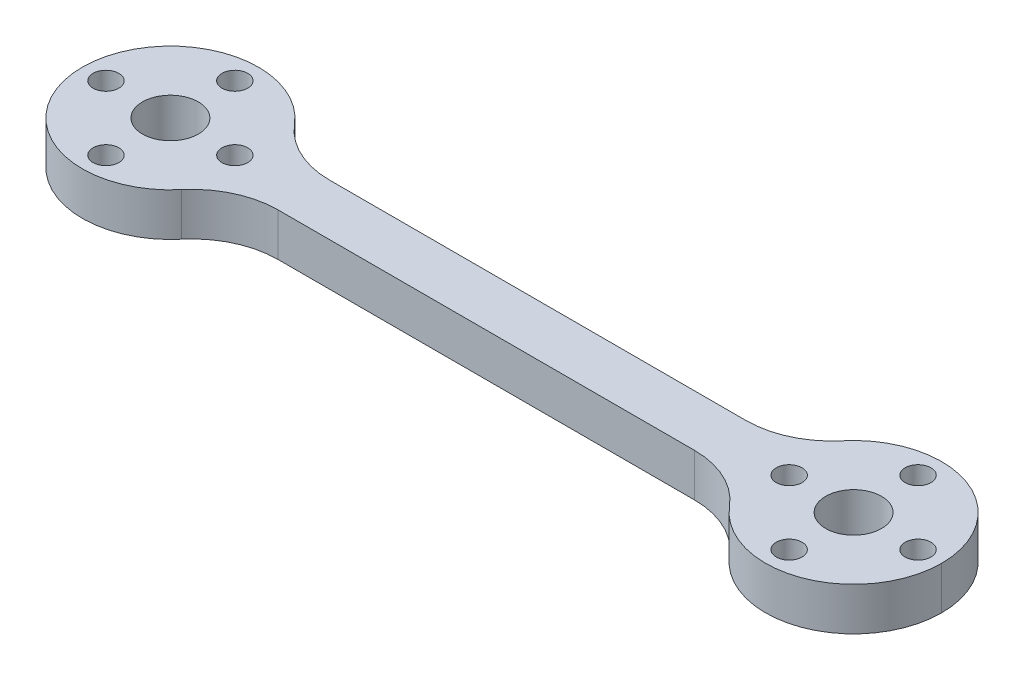
ISO-10303-21;
HEADER;
FILE_DESCRIPTION(('STEP AP214'),'2;1');
FILE_NAME('part.step','',(''),(''),'','','');
FILE_SCHEMA(('AUTOMOTIVE_DESIGN { 1 0 10303 214 1 1 1 1 }'));
ENDSEC;
DATA;
#1=APPLICATION_CONTEXT('core data for automotive mechanical design processes');
#2=APPLICATION_PROTOCOL_DEFINITION('international standard','automotive_design',2000,#1);
#3=PRODUCT_CONTEXT('',#1,'mechanical');
#4=PRODUCT('Part','Part','',(#3));
#5=PRODUCT_RELATED_PRODUCT_CATEGORY('part','',(#4));
#6=PRODUCT_DEFINITION_FORMATION('','',#4);
#7=PRODUCT_DEFINITION_CONTEXT('part definition',#1,'design');
#8=PRODUCT_DEFINITION('design','',#6,#7);
#9=PRODUCT_DEFINITION_SHAPE('','',#8);
#10=(LENGTH_UNIT() NAMED_UNIT(*) SI_UNIT(.MILLI.,.METRE.));
#11=(NAMED_UNIT(*) PLANE_ANGLE_UNIT() SI_UNIT($,.RADIAN.));
#12=(NAMED_UNIT(*) SI_UNIT($,.STERADIAN.) SOLID_ANGLE_UNIT());
#13=UNCERTAINTY_MEASURE_WITH_UNIT(LENGTH_MEASURE(1.E-05),#10,'distance_accuracy_value','');
#14=(GEOMETRIC_REPRESENTATION_CONTEXT(3) GLOBAL_UNCERTAINTY_ASSIGNED_CONTEXT((#13)) GLOBAL_UNIT_ASSIGNED_CONTEXT((#10,
#11,#12)) REPRESENTATION_CONTEXT('',''));
#15=CARTESIAN_POINT('',(0.,0.,0.));
#16=DIRECTION('',(0.,0.,1.));
#17=DIRECTION('',(1.,0.,0.));
#18=AXIS2_PLACEMENT_3D('',#15,#16,#17);
#19=CARTESIAN_POINT('',(0.,5.,0.));
#20=DIRECTION('',(0.,-1.,0.));
#21=DIRECTION('',(0.,0.,-1.));
#22=AXIS2_PLACEMENT_3D('',#19,#20,#21);
#23=PLANE('',#22);
#24=DIRECTION('',(1.,0.,0.));
#25=VECTOR('',#24,1.);
#26=CARTESIAN_POINT('',(20.0511478919563,5.,-13.25));
#27=LINE('',#26,#25);
#28=CARTESIAN_POINT('',(25.7761875552242,5.,-13.25));
#29=VERTEX_POINT('',#28);
#30=CARTESIAN_POINT('',(74.2238124447758,5.,-13.25));
#31=VERTEX_POINT('',#30);
#32=EDGE_CURVE('E140',#29,#31,#27,.T.);
#33=ORIENTED_EDGE('',*,*,#32,.F.);
#34=CARTESIAN_POINT('',(25.7761875552242,5.,-23.25));
#35=DIRECTION('',(0.,-1.,0.));
#36=DIRECTION('',(0.,0.,-1.));
#37=AXIS2_PLACEMENT_3D('',#34,#35,#36);
#38=CIRCLE('',#37,10.);
#39=CARTESIAN_POINT('',(18.1089344415333,5.,-16.8302469135803));
#40=VERTEX_POINT('',#39);
#41=EDGE_CURVE('E43',#29,#40,#38,.T.);
#42=ORIENTED_EDGE('',*,*,#41,.T.);
#43=CARTESIAN_POINT('',(10.25,5.,-10.25));
#44=DIRECTION('',(0.,-1.,0.));
#45=DIRECTION('',(0.,0.,-1.));
#46=AXIS2_PLACEMENT_3D('',#43,#44,#45);
#47=CIRCLE('',#46,10.25);
#48=CARTESIAN_POINT('',(0.,5.,-10.25));
#49=VERTEX_POINT('',#48);
#50=EDGE_CURVE('E248',#40,#49,#47,.F.);
#51=ORIENTED_EDGE('',*,*,#50,.T.);
#52=CARTESIAN_POINT('',(10.25,5.,-10.25));
#53=DIRECTION('',(0.,-1.,0.));
#54=DIRECTION('',(0.,0.,-1.));
#55=AXIS2_PLACEMENT_3D('',#52,#53,#54);
#56=CIRCLE('',#55,10.25);
#57=CARTESIAN_POINT('',(18.1089344415333,5.,-3.66975308641975));
#58=VERTEX_POINT('',#57);
#59=EDGE_CURVE('E132',#49,#58,#56,.F.);
#60=ORIENTED_EDGE('',*,*,#59,.T.);
#61=CARTESIAN_POINT('',(25.7761875552242,5.,2.75));
#62=DIRECTION('',(0.,-1.,0.));
#63=DIRECTION('',(0.,0.,-1.));
#64=AXIS2_PLACEMENT_3D('',#61,#62,#63);
#65=CIRCLE('',#64,10.);
#66=CARTESIAN_POINT('',(25.7761875552242,5.,-7.25));
#67=VERTEX_POINT('',#66);
#68=EDGE_CURVE('E177',#58,#67,#65,.T.);
#69=ORIENTED_EDGE('',*,*,#68,.T.);
#70=DIRECTION('',(-1.,0.,0.));
#71=VECTOR('',#70,1.);
#72=CARTESIAN_POINT('',(20.0511478919563,5.,-7.25));
#73=LINE('',#72,#71);
#74=CARTESIAN_POINT('',(74.2238124447758,5.,-7.25000000000002));
#75=VERTEX_POINT('',#74);
#76=EDGE_CURVE('E182',#75,#67,#73,.T.);
#77=ORIENTED_EDGE('',*,*,#76,.F.);
#78=CARTESIAN_POINT('',(74.2238124447758,5.,2.74999999999998));
#79=DIRECTION('',(0.,-1.,0.));
#80=DIRECTION('',(0.,0.,-1.));
#81=AXIS2_PLACEMENT_3D('',#78,#79,#80);
#82=CIRCLE('',#81,10.);
#83=CARTESIAN_POINT('',(81.8910655584668,5.,-3.66975308641976));
#84=VERTEX_POINT('',#83);
#85=EDGE_CURVE('E173',#75,#84,#82,.T.);
#86=ORIENTED_EDGE('',*,*,#85,.T.);
#87=CARTESIAN_POINT('',(89.75,5.,-10.25));
#88=DIRECTION('',(0.,-1.,0.));
#89=DIRECTION('',(0.,0.,-1.));
#90=AXIS2_PLACEMENT_3D('',#87,#88,#89);
#91=CIRCLE('',#90,10.25);
#92=CARTESIAN_POINT('',(100.,5.,-10.25));
#93=VERTEX_POINT('',#92);
#94=EDGE_CURVE('E122',#84,#93,#91,.F.);
#95=ORIENTED_EDGE('',*,*,#94,.T.);
#96=CARTESIAN_POINT('',(89.75,5.,-10.25));
#97=DIRECTION('',(0.,-1.,0.));
#98=DIRECTION('',(0.,0.,-1.));
#99=AXIS2_PLACEMENT_3D('',#96,#97,#98);
#100=CIRCLE('',#99,10.25);
#101=CARTESIAN_POINT('',(81.8910655584668,5.,-16.8302469135803));
#102=VERTEX_POINT('',#101);
#103=EDGE_CURVE('E247',#93,#102,#100,.F.);
#104=ORIENTED_EDGE('',*,*,#103,.T.);
#105=CARTESIAN_POINT('',(74.2238124447758,5.,-23.25));
#106=DIRECTION('',(0.,-1.,0.));
#107=DIRECTION('',(0.,0.,-1.));
#108=AXIS2_PLACEMENT_3D('',#105,#106,#107);
#109=CIRCLE('',#108,10.);
#110=EDGE_CURVE('E169',#102,#31,#109,.T.);
#111=ORIENTED_EDGE('',*,*,#110,.T.);
#112=EDGE_LOOP('',(#33,#42,#51,#60,#69,#77,#86,#95,#104,#111));
#113=FACE_BOUND('',#112,.T.);
#114=CARTESIAN_POINT('',(10.25,5.,-10.25));
#115=DIRECTION('',(0.,1.,0.));
#116=DIRECTION('',(0.,0.,1.));
#117=AXIS2_PLACEMENT_3D('',#114,#115,#116);
#118=CIRCLE('',#117,3.25);
#119=CARTESIAN_POINT('',(10.25,5.,-7.));
#120=VERTEX_POINT('',#119);
#121=EDGE_CURVE('E242',#120,#120,#118,.T.);
#122=ORIENTED_EDGE('',*,*,#121,.F.);
#123=EDGE_LOOP('',(#122));
#124=FACE_BOUND('',#123,.T.);
#125=CARTESIAN_POINT('',(17.75,5.,-10.25));
#126=DIRECTION('',(0.,1.,0.));
#127=DIRECTION('',(0.,0.,1.));
#128=AXIS2_PLACEMENT_3D('',#125,#126,#127);
#129=CIRCLE('',#128,1.5);
#130=CARTESIAN_POINT('',(17.75,5.,-8.75));
#131=VERTEX_POINT('',#130);
#132=EDGE_CURVE('E299',#131,#131,#129,.T.);
#133=ORIENTED_EDGE('',*,*,#132,.F.);
#134=EDGE_LOOP('',(#133));
#135=FACE_BOUND('',#134,.T.);
#136=CARTESIAN_POINT('',(10.25,5.,-17.75));
#137=DIRECTION('',(0.,1.,0.));
#138=DIRECTION('',(0.,0.,-1.));
#139=AXIS2_PLACEMENT_3D('',#136,#137,#138);
#140=CIRCLE('',#139,1.5);
#141=CARTESIAN_POINT('',(10.25,5.,-19.25));
#142=VERTEX_POINT('',#141);
#143=EDGE_CURVE('E293',#142,#142,#140,.T.);
#144=ORIENTED_EDGE('',*,*,#143,.F.);
#145=EDGE_LOOP('',(#144));
#146=FACE_BOUND('',#145,.T.);
#147=CARTESIAN_POINT('',(10.25,5.,-2.75));
#148=DIRECTION('',(0.,1.,0.));
#149=DIRECTION('',(0.,0.,-1.));
#150=AXIS2_PLACEMENT_3D('',#147,#148,#149);
#151=CIRCLE('',#150,1.5);
#152=CARTESIAN_POINT('',(10.25,5.,-4.25));
#153=VERTEX_POINT('',#152);
#154=EDGE_CURVE('E287',#153,#153,#151,.T.);
#155=ORIENTED_EDGE('',*,*,#154,.F.);
#156=EDGE_LOOP('',(#155));
#157=FACE_BOUND('',#156,.T.);
#158=CARTESIAN_POINT('',(2.75,5.,-10.25));
#159=DIRECTION('',(0.,1.,0.));
#160=DIRECTION('',(0.,0.,1.));
#161=AXIS2_PLACEMENT_3D('',#158,#159,#160);
#162=CIRCLE('',#161,1.5);
#163=CARTESIAN_POINT('',(2.75,5.,-8.75));
#164=VERTEX_POINT('',#163);
#165=EDGE_CURVE('E281',#164,#164,#162,.T.);
#166=ORIENTED_EDGE('',*,*,#165,.F.);
#167=EDGE_LOOP('',(#166));
#168=FACE_BOUND('',#167,.T.);
#169=CARTESIAN_POINT('',(82.25,5.,-10.25));
#170=DIRECTION('',(0.,1.,0.));
#171=DIRECTION('',(0.,0.,-1.));
#172=AXIS2_PLACEMENT_3D('',#169,#170,#171);
#173=CIRCLE('',#172,1.5);
#174=CARTESIAN_POINT('',(82.25,5.,-11.75));
#175=VERTEX_POINT('',#174);
#176=EDGE_CURVE('E275',#175,#175,#173,.T.);
#177=ORIENTED_EDGE('',*,*,#176,.F.);
#178=EDGE_LOOP('',(#177));
#179=FACE_BOUND('',#178,.T.);
#180=CARTESIAN_POINT('',(89.75,5.,-17.75));
#181=DIRECTION('',(0.,1.,0.));
#182=DIRECTION('',(0.,0.,1.));
#183=AXIS2_PLACEMENT_3D('',#180,#181,#182);
#184=CIRCLE('',#183,1.5);
#185=CARTESIAN_POINT('',(89.75,5.,-16.25));
#186=VERTEX_POINT('',#185);
#187=EDGE_CURVE('E269',#186,#186,#184,.T.);
#188=ORIENTED_EDGE('',*,*,#187,.F.);
#189=EDGE_LOOP('',(#188));
#190=FACE_BOUND('',#189,.T.);
#191=CARTESIAN_POINT('',(89.75,5.,-2.75));
#192=DIRECTION('',(0.,1.,0.));
#193=DIRECTION('',(0.,0.,1.));
#194=AXIS2_PLACEMENT_3D('',#191,#192,#193);
#195=CIRCLE('',#194,1.5);
#196=CARTESIAN_POINT('',(89.75,5.,-1.25));
#197=VERTEX_POINT('',#196);
#198=EDGE_CURVE('E263',#197,#197,#195,.T.);
#199=ORIENTED_EDGE('',*,*,#198,.F.);
#200=EDGE_LOOP('',(#199));
#201=FACE_BOUND('',#200,.T.);
#202=CARTESIAN_POINT('',(97.25,5.,-10.25));
#203=DIRECTION('',(0.,1.,0.));
#204=DIRECTION('',(0.,0.,-1.));
#205=AXIS2_PLACEMENT_3D('',#202,#203,#204);
#206=CIRCLE('',#205,1.5);
#207=CARTESIAN_POINT('',(97.25,5.,-11.75));
#208=VERTEX_POINT('',#207);
#209=EDGE_CURVE('E257',#208,#208,#206,.T.);
#210=ORIENTED_EDGE('',*,*,#209,.F.);
#211=EDGE_LOOP('',(#210));
#212=FACE_BOUND('',#211,.T.);
#213=CARTESIAN_POINT('',(89.75,5.,-10.25));
#214=DIRECTION('',(0.,1.,0.));
#215=DIRECTION('',(0.,0.,-1.));
#216=AXIS2_PLACEMENT_3D('',#213,#214,#215);
#217=CIRCLE('',#216,3.24999999999999);
#218=CARTESIAN_POINT('',(89.75,5.,-13.5));
#219=VERTEX_POINT('',#218);
#220=EDGE_CURVE('E137',#219,#219,#217,.T.);
#221=ORIENTED_EDGE('',*,*,#220,.F.);
#222=EDGE_LOOP('',(#221));
#223=FACE_BOUND('',#222,.T.);
#224=ADVANCED_FACE('F35',(#113,#124,#135,#146,#157,#168,#179,#190,#201,#212,#223),#23,.F.);
#225=CARTESIAN_POINT('',(0.,0.,0.));
#226=DIRECTION('',(0.,-1.,0.));
#227=DIRECTION('',(0.,0.,-1.));
#228=AXIS2_PLACEMENT_3D('',#225,#226,#227);
#229=PLANE('',#228);
#230=CARTESIAN_POINT('',(10.25,0.,-10.25));
#231=DIRECTION('',(0.,-1.,0.));
#232=DIRECTION('',(0.,0.,-1.));
#233=AXIS2_PLACEMENT_3D('',#230,#231,#232);
#234=CIRCLE('',#233,10.25);
#235=CARTESIAN_POINT('',(0.,0.,-10.25));
#236=VERTEX_POINT('',#235);
#237=CARTESIAN_POINT('',(18.1089344415333,0.,-16.8302469135803));
#238=VERTEX_POINT('',#237);
#239=EDGE_CURVE('E113',#236,#238,#234,.T.);
#240=ORIENTED_EDGE('',*,*,#239,.T.);
#241=CARTESIAN_POINT('',(25.7761875552242,0.,-23.25));
#242=DIRECTION('',(0.,-1.,0.));
#243=DIRECTION('',(0.,0.,-1.));
#244=AXIS2_PLACEMENT_3D('',#241,#242,#243);
#245=CIRCLE('',#244,10.);
#246=CARTESIAN_POINT('',(25.7761875552242,0.,-13.25));
#247=VERTEX_POINT('',#246);
#248=EDGE_CURVE('E11',#238,#247,#245,.F.);
#249=ORIENTED_EDGE('',*,*,#248,.T.);
#250=DIRECTION('',(-1.,0.,0.));
#251=VECTOR('',#250,1.);
#252=CARTESIAN_POINT('',(0.,0.,-13.25));
#253=LINE('',#252,#251);
#254=CARTESIAN_POINT('',(74.2238124447758,0.,-13.25));
#255=VERTEX_POINT('',#254);
#256=EDGE_CURVE('E148',#255,#247,#253,.T.);
#257=ORIENTED_EDGE('',*,*,#256,.F.);
#258=CARTESIAN_POINT('',(74.2238124447758,0.,-23.25));
#259=DIRECTION('',(0.,-1.,0.));
#260=DIRECTION('',(0.,0.,-1.));
#261=AXIS2_PLACEMENT_3D('',#258,#259,#260);
#262=CIRCLE('',#261,10.);
#263=CARTESIAN_POINT('',(81.8910655584668,0.,-16.8302469135803));
#264=VERTEX_POINT('',#263);
#265=EDGE_CURVE('E171',#255,#264,#262,.F.);
#266=ORIENTED_EDGE('',*,*,#265,.T.);
#267=CARTESIAN_POINT('',(89.75,0.,-10.25));
#268=DIRECTION('',(0.,-1.,0.));
#269=DIRECTION('',(0.,0.,-1.));
#270=AXIS2_PLACEMENT_3D('',#267,#268,#269);
#271=CIRCLE('',#270,10.25);
#272=CARTESIAN_POINT('',(100.,0.,-10.25));
#273=VERTEX_POINT('',#272);
#274=EDGE_CURVE('E128',#264,#273,#271,.T.);
#275=ORIENTED_EDGE('',*,*,#274,.T.);
#276=CARTESIAN_POINT('',(89.75,0.,-10.25));
#277=DIRECTION('',(0.,-1.,0.));
#278=DIRECTION('',(0.,0.,-1.));
#279=AXIS2_PLACEMENT_3D('',#276,#277,#278);
#280=CIRCLE('',#279,10.25);
#281=CARTESIAN_POINT('',(81.8910655584668,0.,-3.66975308641976));
#282=VERTEX_POINT('',#281);
#283=EDGE_CURVE('E240',#273,#282,#280,.T.);
#284=ORIENTED_EDGE('',*,*,#283,.T.);
#285=CARTESIAN_POINT('',(74.2238124447758,0.,2.74999999999998));
#286=DIRECTION('',(0.,-1.,0.));
#287=DIRECTION('',(0.,0.,-1.));
#288=AXIS2_PLACEMENT_3D('',#285,#286,#287);
#289=CIRCLE('',#288,10.);
#290=CARTESIAN_POINT('',(74.2238124447758,0.,-7.25000000000002));
#291=VERTEX_POINT('',#290);
#292=EDGE_CURVE('E175',#282,#291,#289,.F.);
#293=ORIENTED_EDGE('',*,*,#292,.T.);
#294=DIRECTION('',(1.,0.,0.));
#295=VECTOR('',#294,1.);
#296=CARTESIAN_POINT('',(0.,0.,-7.24999999999999));
#297=LINE('',#296,#295);
#298=CARTESIAN_POINT('',(25.7761875552242,0.,-7.25));
#299=VERTEX_POINT('',#298);
#300=EDGE_CURVE('E145',#299,#291,#297,.T.);
#301=ORIENTED_EDGE('',*,*,#300,.F.);
#302=CARTESIAN_POINT('',(25.7761875552242,0.,2.75));
#303=DIRECTION('',(0.,-1.,0.));
#304=DIRECTION('',(0.,0.,-1.));
#305=AXIS2_PLACEMENT_3D('',#302,#303,#304);
#306=CIRCLE('',#305,10.);
#307=CARTESIAN_POINT('',(18.1089344415333,0.,-3.66975308641975));
#308=VERTEX_POINT('',#307);
#309=EDGE_CURVE('E117',#299,#308,#306,.F.);
#310=ORIENTED_EDGE('',*,*,#309,.T.);
#311=CARTESIAN_POINT('',(10.25,0.,-10.25));
#312=DIRECTION('',(0.,-1.,0.));
#313=DIRECTION('',(0.,0.,-1.));
#314=AXIS2_PLACEMENT_3D('',#311,#312,#313);
#315=CIRCLE('',#314,10.25);
#316=EDGE_CURVE('E110',#308,#236,#315,.T.);
#317=ORIENTED_EDGE('',*,*,#316,.T.);
#318=EDGE_LOOP('',(#240,#249,#257,#266,#275,#284,#293,#301,#310,#317));
#319=FACE_BOUND('',#318,.T.);
#320=CARTESIAN_POINT('',(97.25,0.,-10.25));
#321=DIRECTION('',(0.,1.,0.));
#322=DIRECTION('',(0.,0.,-1.));
#323=AXIS2_PLACEMENT_3D('',#320,#321,#322);
#324=CIRCLE('',#323,1.5);
#325=CARTESIAN_POINT('',(97.25,0.,-11.75));
#326=VERTEX_POINT('',#325);
#327=EDGE_CURVE('E255',#326,#326,#324,.T.);
#328=ORIENTED_EDGE('',*,*,#327,.T.);
#329=EDGE_LOOP('',(#328));
#330=FACE_BOUND('',#329,.T.);
#331=CARTESIAN_POINT('',(89.75,0.,-17.75));
#332=DIRECTION('',(0.,1.,0.));
#333=DIRECTION('',(0.,0.,1.));
#334=AXIS2_PLACEMENT_3D('',#331,#332,#333);
#335=CIRCLE('',#334,1.5);
#336=CARTESIAN_POINT('',(89.75,0.,-16.25));
#337=VERTEX_POINT('',#336);
#338=EDGE_CURVE('E266',#337,#337,#335,.T.);
#339=ORIENTED_EDGE('',*,*,#338,.T.);
#340=EDGE_LOOP('',(#339));
#341=FACE_BOUND('',#340,.T.);
#342=CARTESIAN_POINT('',(2.75,0.,-10.25));
#343=DIRECTION('',(0.,1.,0.));
#344=DIRECTION('',(0.,0.,1.));
#345=AXIS2_PLACEMENT_3D('',#342,#343,#344);
#346=CIRCLE('',#345,1.5);
#347=CARTESIAN_POINT('',(2.75,0.,-8.75));
#348=VERTEX_POINT('',#347);
#349=EDGE_CURVE('E278',#348,#348,#346,.T.);
#350=ORIENTED_EDGE('',*,*,#349,.T.);
#351=EDGE_LOOP('',(#350));
#352=FACE_BOUND('',#351,.T.);
#353=CARTESIAN_POINT('',(10.25,0.,-17.75));
#354=DIRECTION('',(0.,1.,0.));
#355=DIRECTION('',(0.,0.,-1.));
#356=AXIS2_PLACEMENT_3D('',#353,#354,#355);
#357=CIRCLE('',#356,1.5);
#358=CARTESIAN_POINT('',(10.25,0.,-19.25));
#359=VERTEX_POINT('',#358);
#360=EDGE_CURVE('E290',#359,#359,#357,.T.);
#361=ORIENTED_EDGE('',*,*,#360,.T.);
#362=EDGE_LOOP('',(#361));
#363=FACE_BOUND('',#362,.T.);
#364=CARTESIAN_POINT('',(10.25,0.,-10.25));
#365=DIRECTION('',(0.,1.,0.));
#366=DIRECTION('',(0.,0.,1.));
#367=AXIS2_PLACEMENT_3D('',#364,#365,#366);
#368=CIRCLE('',#367,3.25);
#369=CARTESIAN_POINT('',(10.25,0.,-7.));
#370=VERTEX_POINT('',#369);
#371=EDGE_CURVE('E302',#370,#370,#368,.T.);
#372=ORIENTED_EDGE('',*,*,#371,.T.);
#373=EDGE_LOOP('',(#372));
#374=FACE_BOUND('',#373,.T.);
#375=CARTESIAN_POINT('',(17.75,0.,-10.25));
#376=DIRECTION('',(0.,1.,0.));
#377=DIRECTION('',(0.,0.,1.));
#378=AXIS2_PLACEMENT_3D('',#375,#376,#377);
#379=CIRCLE('',#378,1.5);
#380=CARTESIAN_POINT('',(17.75,0.,-8.75));
#381=VERTEX_POINT('',#380);
#382=EDGE_CURVE('E296',#381,#381,#379,.T.);
#383=ORIENTED_EDGE('',*,*,#382,.T.);
#384=EDGE_LOOP('',(#383));
#385=FACE_BOUND('',#384,.T.);
#386=CARTESIAN_POINT('',(10.25,0.,-2.75));
#387=DIRECTION('',(0.,1.,0.));
#388=DIRECTION('',(0.,0.,-1.));
#389=AXIS2_PLACEMENT_3D('',#386,#387,#388);
#390=CIRCLE('',#389,1.5);
#391=CARTESIAN_POINT('',(10.25,0.,-4.25));
#392=VERTEX_POINT('',#391);
#393=EDGE_CURVE('E284',#392,#392,#390,.T.);
#394=ORIENTED_EDGE('',*,*,#393,.T.);
#395=EDGE_LOOP('',(#394));
#396=FACE_BOUND('',#395,.T.);
#397=CARTESIAN_POINT('',(82.25,0.,-10.25));
#398=DIRECTION('',(0.,1.,0.));
#399=DIRECTION('',(0.,0.,-1.));
#400=AXIS2_PLACEMENT_3D('',#397,#398,#399);
#401=CIRCLE('',#400,1.5);
#402=CARTESIAN_POINT('',(82.25,0.,-11.75));
#403=VERTEX_POINT('',#402);
#404=EDGE_CURVE('E272',#403,#403,#401,.T.);
#405=ORIENTED_EDGE('',*,*,#404,.T.);
#406=EDGE_LOOP('',(#405));
#407=FACE_BOUND('',#406,.T.);
#408=CARTESIAN_POINT('',(89.75,0.,-2.75));
#409=DIRECTION('',(0.,1.,0.));
#410=DIRECTION('',(0.,0.,1.));
#411=AXIS2_PLACEMENT_3D('',#408,#409,#410);
#412=CIRCLE('',#411,1.5);
#413=CARTESIAN_POINT('',(89.75,0.,-1.25));
#414=VERTEX_POINT('',#413);
#415=EDGE_CURVE('E260',#414,#414,#412,.T.);
#416=ORIENTED_EDGE('',*,*,#415,.T.);
#417=EDGE_LOOP('',(#416));
#418=FACE_BOUND('',#417,.T.);
#419=CARTESIAN_POINT('',(89.75,0.,-10.25));
#420=DIRECTION('',(0.,1.,0.));
#421=DIRECTION('',(0.,0.,-1.));
#422=AXIS2_PLACEMENT_3D('',#419,#420,#421);
#423=CIRCLE('',#422,3.24999999999999);
#424=CARTESIAN_POINT('',(89.75,0.,-13.5));
#425=VERTEX_POINT('',#424);
#426=EDGE_CURVE('E133',#425,#425,#423,.T.);
#427=ORIENTED_EDGE('',*,*,#426,.T.);
#428=EDGE_LOOP('',(#427));
#429=FACE_BOUND('',#428,.T.);
#430=ADVANCED_FACE('F111',(#319,#330,#341,#352,#363,#374,#385,#396,#407,#418,#429),#229,.T.);
#431=CARTESIAN_POINT('',(10.25,5.,-10.25));
#432=DIRECTION('',(0.,-1.,0.));
#433=DIRECTION('',(0.,0.,-1.));
#434=AXIS2_PLACEMENT_3D('',#431,#432,#433);
#435=CYLINDRICAL_SURFACE('',#434,3.25);
#436=ORIENTED_EDGE('',*,*,#121,.T.);
#437=EDGE_LOOP('',(#436));
#438=FACE_BOUND('',#437,.T.);
#439=ORIENTED_EDGE('',*,*,#371,.F.);
#440=EDGE_LOOP('',(#439));
#441=FACE_BOUND('',#440,.T.);
#442=ADVANCED_FACE('F205',(#438,#441),#435,.F.);
#443=CARTESIAN_POINT('',(17.75,5.,-10.25));
#444=DIRECTION('',(0.,-1.,0.));
#445=DIRECTION('',(0.,0.,-1.));
#446=AXIS2_PLACEMENT_3D('',#443,#444,#445);
#447=CYLINDRICAL_SURFACE('',#446,1.5);
#448=ORIENTED_EDGE('',*,*,#132,.T.);
#449=EDGE_LOOP('',(#448));
#450=FACE_BOUND('',#449,.T.);
#451=ORIENTED_EDGE('',*,*,#382,.F.);
#452=EDGE_LOOP('',(#451));
#453=FACE_BOUND('',#452,.T.);
#454=ADVANCED_FACE('F312',(#450,#453),#447,.F.);
#455=CARTESIAN_POINT('',(10.25,5.,-17.75));
#456=DIRECTION('',(0.,-1.,0.));
#457=DIRECTION('',(0.,0.,-1.));
#458=AXIS2_PLACEMENT_3D('',#455,#456,#457);
#459=CYLINDRICAL_SURFACE('',#458,1.5);
#460=ORIENTED_EDGE('',*,*,#143,.T.);
#461=EDGE_LOOP('',(#460));
#462=FACE_BOUND('',#461,.T.);
#463=ORIENTED_EDGE('',*,*,#360,.F.);
#464=EDGE_LOOP('',(#463));
#465=FACE_BOUND('',#464,.T.);
#466=ADVANCED_FACE('F317',(#462,#465),#459,.F.);
#467=CARTESIAN_POINT('',(10.25,5.,-2.75));
#468=DIRECTION('',(0.,-1.,0.));
#469=DIRECTION('',(0.,0.,-1.));
#470=AXIS2_PLACEMENT_3D('',#467,#468,#469);
#471=CYLINDRICAL_SURFACE('',#470,1.5);
#472=ORIENTED_EDGE('',*,*,#154,.T.);
#473=EDGE_LOOP('',(#472));
#474=FACE_BOUND('',#473,.T.);
#475=ORIENTED_EDGE('',*,*,#393,.F.);
#476=EDGE_LOOP('',(#475));
#477=FACE_BOUND('',#476,.T.);
#478=ADVANCED_FACE('F367',(#474,#477),#471,.F.);
#479=CARTESIAN_POINT('',(2.75,5.,-10.25));
#480=DIRECTION('',(0.,-1.,0.));
#481=DIRECTION('',(0.,0.,-1.));
#482=AXIS2_PLACEMENT_3D('',#479,#480,#481);
#483=CYLINDRICAL_SURFACE('',#482,1.5);
#484=ORIENTED_EDGE('',*,*,#165,.T.);
#485=EDGE_LOOP('',(#484));
#486=FACE_BOUND('',#485,.T.);
#487=ORIENTED_EDGE('',*,*,#349,.F.);
#488=EDGE_LOOP('',(#487));
#489=FACE_BOUND('',#488,.T.);
#490=ADVANCED_FACE('F363',(#486,#489),#483,.F.);
#491=CARTESIAN_POINT('',(82.25,5.,-10.25));
#492=DIRECTION('',(0.,-1.,0.));
#493=DIRECTION('',(0.,0.,-1.));
#494=AXIS2_PLACEMENT_3D('',#491,#492,#493);
#495=CYLINDRICAL_SURFACE('',#494,1.5);
#496=ORIENTED_EDGE('',*,*,#176,.T.);
#497=EDGE_LOOP('',(#496));
#498=FACE_BOUND('',#497,.T.);
#499=ORIENTED_EDGE('',*,*,#404,.F.);
#500=EDGE_LOOP('',(#499));
#501=FACE_BOUND('',#500,.T.);
#502=ADVANCED_FACE('F359',(#498,#501),#495,.F.);
#503=CARTESIAN_POINT('',(89.75,5.,-17.75));
#504=DIRECTION('',(0.,-1.,0.));
#505=DIRECTION('',(0.,0.,-1.));
#506=AXIS2_PLACEMENT_3D('',#503,#504,#505);
#507=CYLINDRICAL_SURFACE('',#506,1.5);
#508=ORIENTED_EDGE('',*,*,#187,.T.);
#509=EDGE_LOOP('',(#508));
#510=FACE_BOUND('',#509,.T.);
#511=ORIENTED_EDGE('',*,*,#338,.F.);
#512=EDGE_LOOP('',(#511));
#513=FACE_BOUND('',#512,.T.);
#514=ADVANCED_FACE('F355',(#510,#513),#507,.F.);
#515=CARTESIAN_POINT('',(89.75,5.,-2.75));
#516=DIRECTION('',(0.,-1.,0.));
#517=DIRECTION('',(0.,0.,-1.));
#518=AXIS2_PLACEMENT_3D('',#515,#516,#517);
#519=CYLINDRICAL_SURFACE('',#518,1.5);
#520=ORIENTED_EDGE('',*,*,#198,.T.);
#521=EDGE_LOOP('',(#520));
#522=FACE_BOUND('',#521,.T.);
#523=ORIENTED_EDGE('',*,*,#415,.F.);
#524=EDGE_LOOP('',(#523));
#525=FACE_BOUND('',#524,.T.);
#526=ADVANCED_FACE('F348',(#522,#525),#519,.F.);
#527=CARTESIAN_POINT('',(97.25,5.,-10.25));
#528=DIRECTION('',(0.,-1.,0.));
#529=DIRECTION('',(0.,0.,-1.));
#530=AXIS2_PLACEMENT_3D('',#527,#528,#529);
#531=CYLINDRICAL_SURFACE('',#530,1.5);
#532=ORIENTED_EDGE('',*,*,#209,.T.);
#533=EDGE_LOOP('',(#532));
#534=FACE_BOUND('',#533,.T.);
#535=ORIENTED_EDGE('',*,*,#327,.F.);
#536=EDGE_LOOP('',(#535));
#537=FACE_BOUND('',#536,.T.);
#538=ADVANCED_FACE('F341',(#534,#537),#531,.F.);
#539=CARTESIAN_POINT('',(89.75,5.,-10.25));
#540=DIRECTION('',(0.,-1.,0.));
#541=DIRECTION('',(0.,0.,-1.));
#542=AXIS2_PLACEMENT_3D('',#539,#540,#541);
#543=CYLINDRICAL_SURFACE('',#542,3.24999999999999);
#544=ORIENTED_EDGE('',*,*,#220,.T.);
#545=EDGE_LOOP('',(#544));
#546=FACE_BOUND('',#545,.T.);
#547=ORIENTED_EDGE('',*,*,#426,.F.);
#548=EDGE_LOOP('',(#547));
#549=FACE_BOUND('',#548,.T.);
#550=ADVANCED_FACE('F215',(#546,#549),#543,.F.);
#551=CARTESIAN_POINT('',(10.25,5.,-10.25));
#552=DIRECTION('',(0.,-1.,0.));
#553=DIRECTION('',(0.,0.,-1.));
#554=AXIS2_PLACEMENT_3D('',#551,#552,#553);
#555=CYLINDRICAL_SURFACE('',#554,10.25);
#556=ORIENTED_EDGE('',*,*,#50,.F.);
#557=DIRECTION('',(0.,-1.,0.));
#558=VECTOR('',#557,1.);
#559=CARTESIAN_POINT('',(18.1089344415333,5.,-16.8302469135803));
#560=LINE('',#559,#558);
#561=EDGE_CURVE('E50',#40,#238,#560,.T.);
#562=ORIENTED_EDGE('',*,*,#561,.T.);
#563=ORIENTED_EDGE('',*,*,#239,.F.);
#564=DIRECTION('',(0.,-1.,0.));
#565=VECTOR('',#564,1.);
#566=CARTESIAN_POINT('',(0.,5.,-10.25));
#567=LINE('',#566,#565);
#568=EDGE_CURVE('E126',#49,#236,#567,.T.);
#569=ORIENTED_EDGE('',*,*,#568,.F.);
#570=EDGE_LOOP('',(#556,#562,#563,#569));
#571=FACE_BOUND('',#570,.T.);
#572=ADVANCED_FACE('F125',(#571),#555,.T.);
#573=CARTESIAN_POINT('',(10.25,5.,-10.25));
#574=DIRECTION('',(0.,-1.,0.));
#575=DIRECTION('',(0.,0.,-1.));
#576=AXIS2_PLACEMENT_3D('',#573,#574,#575);
#577=CYLINDRICAL_SURFACE('',#576,10.25);
#578=ORIENTED_EDGE('',*,*,#316,.F.);
#579=DIRECTION('',(0.,-1.,0.));
#580=VECTOR('',#579,1.);
#581=CARTESIAN_POINT('',(18.1089344415333,5.,-3.66975308641975));
#582=LINE('',#581,#580);
#583=EDGE_CURVE('E166',#308,#58,#582,.F.);
#584=ORIENTED_EDGE('',*,*,#583,.T.);
#585=ORIENTED_EDGE('',*,*,#59,.F.);
#586=ORIENTED_EDGE('',*,*,#568,.T.);
#587=EDGE_LOOP('',(#578,#584,#585,#586));
#588=FACE_BOUND('',#587,.T.);
#589=ADVANCED_FACE('F130',(#588),#577,.T.);
#590=CARTESIAN_POINT('',(89.75,5.,-10.25));
#591=DIRECTION('',(0.,-1.,0.));
#592=DIRECTION('',(0.,0.,-1.));
#593=AXIS2_PLACEMENT_3D('',#590,#591,#592);
#594=CYLINDRICAL_SURFACE('',#593,10.25);
#595=ORIENTED_EDGE('',*,*,#94,.F.);
#596=DIRECTION('',(0.,-1.,0.));
#597=VECTOR('',#596,1.);
#598=CARTESIAN_POINT('',(81.8910655584668,5.,-3.66975308641976));
#599=LINE('',#598,#597);
#600=EDGE_CURVE('E164',#84,#282,#599,.T.);
#601=ORIENTED_EDGE('',*,*,#600,.T.);
#602=ORIENTED_EDGE('',*,*,#283,.F.);
#603=DIRECTION('',(0.,-1.,0.));
#604=VECTOR('',#603,1.);
#605=CARTESIAN_POINT('',(100.,5.,-10.25));
#606=LINE('',#605,#604);
#607=EDGE_CURVE('E134',#93,#273,#606,.T.);
#608=ORIENTED_EDGE('',*,*,#607,.F.);
#609=EDGE_LOOP('',(#595,#601,#602,#608));
#610=FACE_BOUND('',#609,.T.);
#611=ADVANCED_FACE('F212',(#610),#594,.T.);
#612=CARTESIAN_POINT('',(89.75,5.,-10.25));
#613=DIRECTION('',(0.,-1.,0.));
#614=DIRECTION('',(0.,0.,-1.));
#615=AXIS2_PLACEMENT_3D('',#612,#613,#614);
#616=CYLINDRICAL_SURFACE('',#615,10.25);
#617=ORIENTED_EDGE('',*,*,#274,.F.);
#618=DIRECTION('',(0.,-1.,0.));
#619=VECTOR('',#618,1.);
#620=CARTESIAN_POINT('',(81.8910655584668,5.,-16.8302469135803));
#621=LINE('',#620,#619);
#622=EDGE_CURVE('E151',#264,#102,#621,.F.);
#623=ORIENTED_EDGE('',*,*,#622,.T.);
#624=ORIENTED_EDGE('',*,*,#103,.F.);
#625=ORIENTED_EDGE('',*,*,#607,.T.);
#626=EDGE_LOOP('',(#617,#623,#624,#625));
#627=FACE_BOUND('',#626,.T.);
#628=ADVANCED_FACE('F216',(#627),#616,.T.);
#629=CARTESIAN_POINT('',(20.0511478919563,-5.,-13.25));
#630=DIRECTION('',(0.,0.,1.));
#631=DIRECTION('',(1.,0.,0.));
#632=AXIS2_PLACEMENT_3D('',#629,#630,#631);
#633=PLANE('',#632);
#634=ORIENTED_EDGE('',*,*,#32,.T.);
#635=DIRECTION('',(0.,-1.,0.));
#636=VECTOR('',#635,1.);
#637=CARTESIAN_POINT('',(74.2238124447758,-5.,-13.25));
#638=LINE('',#637,#636);
#639=EDGE_CURVE('E157',#31,#255,#638,.T.);
#640=ORIENTED_EDGE('',*,*,#639,.T.);
#641=ORIENTED_EDGE('',*,*,#256,.T.);
#642=DIRECTION('',(0.,-1.,0.));
#643=VECTOR('',#642,1.);
#644=CARTESIAN_POINT('',(25.7761875552242,-5.,-13.25));
#645=LINE('',#644,#643);
#646=EDGE_CURVE('E154',#247,#29,#645,.F.);
#647=ORIENTED_EDGE('',*,*,#646,.T.);
#648=EDGE_LOOP('',(#634,#640,#641,#647));
#649=FACE_BOUND('',#648,.T.);
#650=ADVANCED_FACE('F219',(#649),#633,.F.);
#651=CARTESIAN_POINT('',(20.0511478919563,-5.,-7.25));
#652=DIRECTION('',(0.,0.,-1.));
#653=DIRECTION('',(-1.,0.,0.));
#654=AXIS2_PLACEMENT_3D('',#651,#652,#653);
#655=PLANE('',#654);
#656=ORIENTED_EDGE('',*,*,#300,.T.);
#657=DIRECTION('',(0.,-1.,0.));
#658=VECTOR('',#657,1.);
#659=CARTESIAN_POINT('',(74.2238124447758,-5.,-7.25000000000002));
#660=LINE('',#659,#658);
#661=EDGE_CURVE('E161',#291,#75,#660,.F.);
#662=ORIENTED_EDGE('',*,*,#661,.T.);
#663=ORIENTED_EDGE('',*,*,#76,.T.);
#664=DIRECTION('',(0.,-1.,0.));
#665=VECTOR('',#664,1.);
#666=CARTESIAN_POINT('',(25.7761875552242,-5.,-7.25));
#667=LINE('',#666,#665);
#668=EDGE_CURVE('E159',#67,#299,#667,.T.);
#669=ORIENTED_EDGE('',*,*,#668,.T.);
#670=EDGE_LOOP('',(#656,#662,#663,#669));
#671=FACE_BOUND('',#670,.T.);
#672=ADVANCED_FACE('F186',(#671),#655,.F.);
#673=CARTESIAN_POINT('',(74.2238124447758,5.,-23.25));
#674=DIRECTION('',(0.,-1.,0.));
#675=DIRECTION('',(0.,0.,-1.));
#676=AXIS2_PLACEMENT_3D('',#673,#674,#675);
#677=CYLINDRICAL_SURFACE('',#676,10.);
#678=ORIENTED_EDGE('',*,*,#265,.F.);
#679=ORIENTED_EDGE('',*,*,#639,.F.);
#680=ORIENTED_EDGE('',*,*,#110,.F.);
#681=ORIENTED_EDGE('',*,*,#622,.F.);
#682=EDGE_LOOP('',(#678,#679,#680,#681));
#683=FACE_BOUND('',#682,.T.);
#684=ADVANCED_FACE('F197',(#683),#677,.F.);
#685=CARTESIAN_POINT('',(74.2238124447758,5.,2.74999999999998));
#686=DIRECTION('',(0.,-1.,0.));
#687=DIRECTION('',(0.,0.,-1.));
#688=AXIS2_PLACEMENT_3D('',#685,#686,#687);
#689=CYLINDRICAL_SURFACE('',#688,10.);
#690=ORIENTED_EDGE('',*,*,#292,.F.);
#691=ORIENTED_EDGE('',*,*,#600,.F.);
#692=ORIENTED_EDGE('',*,*,#85,.F.);
#693=ORIENTED_EDGE('',*,*,#661,.F.);
#694=EDGE_LOOP('',(#690,#691,#692,#693));
#695=FACE_BOUND('',#694,.T.);
#696=ADVANCED_FACE('F191',(#695),#689,.F.);
#697=CARTESIAN_POINT('',(25.7761875552242,5.,2.75));
#698=DIRECTION('',(0.,-1.,0.));
#699=DIRECTION('',(0.,0.,-1.));
#700=AXIS2_PLACEMENT_3D('',#697,#698,#699);
#701=CYLINDRICAL_SURFACE('',#700,10.);
#702=ORIENTED_EDGE('',*,*,#309,.F.);
#703=ORIENTED_EDGE('',*,*,#668,.F.);
#704=ORIENTED_EDGE('',*,*,#68,.F.);
#705=ORIENTED_EDGE('',*,*,#583,.F.);
#706=EDGE_LOOP('',(#702,#703,#704,#705));
#707=FACE_BOUND('',#706,.T.);
#708=ADVANCED_FACE('F189',(#707),#701,.F.);
#709=CARTESIAN_POINT('',(25.7761875552242,5.,-23.25));
#710=DIRECTION('',(0.,-1.,0.));
#711=DIRECTION('',(0.,0.,-1.));
#712=AXIS2_PLACEMENT_3D('',#709,#710,#711);
#713=CYLINDRICAL_SURFACE('',#712,10.);
#714=ORIENTED_EDGE('',*,*,#248,.F.);
#715=ORIENTED_EDGE('',*,*,#561,.F.);
#716=ORIENTED_EDGE('',*,*,#41,.F.);
#717=ORIENTED_EDGE('',*,*,#646,.F.);
#718=EDGE_LOOP('',(#714,#715,#716,#717));
#719=FACE_BOUND('',#718,.T.);
#720=ADVANCED_FACE('F37',(#719),#713,.F.);
#721=CLOSED_SHELL('',(#224,#430,#442,#454,#466,#478,#490,#502,#514,#526,#538,#550,#572,#589,
#611,#628,#650,#672,#684,#696,#708,#720));
#722=MANIFOLD_SOLID_BREP('B2',#721);
#723=ADVANCED_BREP_SHAPE_REPRESENTATION('',(#18,#722),#14);
#724=SHAPE_DEFINITION_REPRESENTATION(#9,#723);
ENDSEC;
END-ISO-10303-21;
